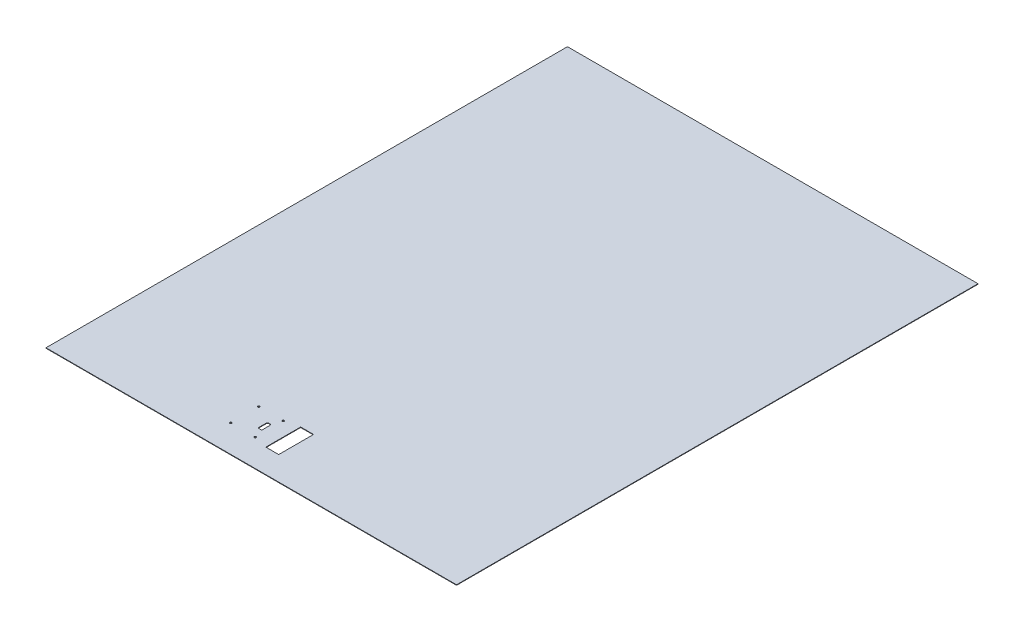
ISO-10303-21;
HEADER;
FILE_DESCRIPTION(('STEP AP214'),'2;1');
FILE_NAME('part.step','',(''),(''),'','','');
FILE_SCHEMA(('AUTOMOTIVE_DESIGN { 1 0 10303 214 1 1 1 1 }'));
ENDSEC;
DATA;
#1=APPLICATION_CONTEXT('core data for automotive mechanical design processes');
#2=APPLICATION_PROTOCOL_DEFINITION('international standard','automotive_design',2000,#1);
#3=PRODUCT_CONTEXT('',#1,'mechanical');
#4=PRODUCT('Part','Part','',(#3));
#5=PRODUCT_RELATED_PRODUCT_CATEGORY('part','',(#4));
#6=PRODUCT_DEFINITION_FORMATION('','',#4);
#7=PRODUCT_DEFINITION_CONTEXT('part definition',#1,'design');
#8=PRODUCT_DEFINITION('design','',#6,#7);
#9=PRODUCT_DEFINITION_SHAPE('','',#8);
#10=(LENGTH_UNIT() NAMED_UNIT(*) SI_UNIT(.MILLI.,.METRE.));
#11=(NAMED_UNIT(*) PLANE_ANGLE_UNIT() SI_UNIT($,.RADIAN.));
#12=(NAMED_UNIT(*) SI_UNIT($,.STERADIAN.) SOLID_ANGLE_UNIT());
#13=UNCERTAINTY_MEASURE_WITH_UNIT(LENGTH_MEASURE(1.E-05),#10,'distance_accuracy_value','');
#14=(GEOMETRIC_REPRESENTATION_CONTEXT(3) GLOBAL_UNCERTAINTY_ASSIGNED_CONTEXT((#13)) GLOBAL_UNIT_ASSIGNED_CONTEXT((#10,
#11,#12)) REPRESENTATION_CONTEXT('',''));
#15=CARTESIAN_POINT('',(0.,0.,0.));
#16=DIRECTION('',(0.,0.,1.));
#17=DIRECTION('',(1.,0.,0.));
#18=AXIS2_PLACEMENT_3D('',#15,#16,#17);
#19=CARTESIAN_POINT('',(612.606476286078,1.,310.950998870896));
#20=DIRECTION('',(-1.,0.,0.));
#21=DIRECTION('',(0.,0.,1.));
#22=AXIS2_PLACEMENT_3D('',#19,#20,#21);
#23=PLANE('',#22);
#24=DIRECTION('',(0.,0.,-1.));
#25=VECTOR('',#24,1.);
#26=CARTESIAN_POINT('',(612.606476286078,0.,310.950998870896));
#27=LINE('',#26,#25);
#28=CARTESIAN_POINT('',(612.606476286078,0.,310.950998870896));
#29=VERTEX_POINT('',#28);
#30=CARTESIAN_POINT('',(612.606476286078,0.,-782.049001129104));
#31=VERTEX_POINT('',#30);
#32=EDGE_CURVE('E191',#29,#31,#27,.T.);
#33=ORIENTED_EDGE('',*,*,#32,.T.);
#34=DIRECTION('',(0.,-1.,0.));
#35=VECTOR('',#34,1.);
#36=CARTESIAN_POINT('',(612.606476286078,1.,-782.049001129104));
#37=LINE('',#36,#35);
#38=CARTESIAN_POINT('',(612.606476286078,1.,-782.049001129104));
#39=VERTEX_POINT('',#38);
#40=EDGE_CURVE('E221',#39,#31,#37,.T.);
#41=ORIENTED_EDGE('',*,*,#40,.F.);
#42=DIRECTION('',(0.,0.,-1.));
#43=VECTOR('',#42,1.);
#44=CARTESIAN_POINT('',(612.606476286078,1.,310.950998870896));
#45=LINE('',#44,#43);
#46=CARTESIAN_POINT('',(612.606476286078,1.,310.950998870896));
#47=VERTEX_POINT('',#46);
#48=EDGE_CURVE('E195',#47,#39,#45,.T.);
#49=ORIENTED_EDGE('',*,*,#48,.F.);
#50=DIRECTION('',(0.,-1.,0.));
#51=VECTOR('',#50,1.);
#52=CARTESIAN_POINT('',(612.606476286078,1.,310.950998870896));
#53=LINE('',#52,#51);
#54=EDGE_CURVE('E205',#47,#29,#53,.T.);
#55=ORIENTED_EDGE('',*,*,#54,.T.);
#56=EDGE_LOOP('',(#33,#41,#49,#55));
#57=FACE_BOUND('',#56,.T.);
#58=ADVANCED_FACE('F33',(#57),#23,.F.);
#59=CARTESIAN_POINT('',(612.606476286078,1.,-782.049001129104));
#60=DIRECTION('',(0.,0.,1.));
#61=DIRECTION('',(1.,0.,0.));
#62=AXIS2_PLACEMENT_3D('',#59,#60,#61);
#63=PLANE('',#62);
#64=DIRECTION('',(-1.,0.,0.));
#65=VECTOR('',#64,1.);
#66=CARTESIAN_POINT('',(612.606476286078,0.,-782.049001129104));
#67=LINE('',#66,#65);
#68=CARTESIAN_POINT('',(-247.893523713922,0.,-782.049001129104));
#69=VERTEX_POINT('',#68);
#70=EDGE_CURVE('E208',#31,#69,#67,.T.);
#71=ORIENTED_EDGE('',*,*,#70,.T.);
#72=DIRECTION('',(0.,-1.,0.));
#73=VECTOR('',#72,1.);
#74=CARTESIAN_POINT('',(-247.893523713922,1.,-782.049001129104));
#75=LINE('',#74,#73);
#76=CARTESIAN_POINT('',(-247.893523713922,1.,-782.049001129104));
#77=VERTEX_POINT('',#76);
#78=EDGE_CURVE('E218',#77,#69,#75,.T.);
#79=ORIENTED_EDGE('',*,*,#78,.F.);
#80=DIRECTION('',(-1.,0.,0.));
#81=VECTOR('',#80,1.);
#82=CARTESIAN_POINT('',(612.606476286078,1.,-782.049001129104));
#83=LINE('',#82,#81);
#84=EDGE_CURVE('E198',#39,#77,#83,.T.);
#85=ORIENTED_EDGE('',*,*,#84,.F.);
#86=ORIENTED_EDGE('',*,*,#40,.T.);
#87=EDGE_LOOP('',(#71,#79,#85,#86));
#88=FACE_BOUND('',#87,.T.);
#89=ADVANCED_FACE('F330',(#88),#63,.F.);
#90=CARTESIAN_POINT('',(-247.893523713922,1.,310.950998870896));
#91=DIRECTION('',(1.,0.,0.));
#92=DIRECTION('',(0.,0.,-1.));
#93=AXIS2_PLACEMENT_3D('',#90,#91,#92);
#94=PLANE('',#93);
#95=DIRECTION('',(0.,0.,1.));
#96=VECTOR('',#95,1.);
#97=CARTESIAN_POINT('',(-247.893523713922,0.,310.950998870896));
#98=LINE('',#97,#96);
#99=CARTESIAN_POINT('',(-247.893523713922,0.,310.950998870896));
#100=VERTEX_POINT('',#99);
#101=EDGE_CURVE('E210',#69,#100,#98,.T.);
#102=ORIENTED_EDGE('',*,*,#101,.T.);
#103=DIRECTION('',(0.,-1.,0.));
#104=VECTOR('',#103,1.);
#105=CARTESIAN_POINT('',(-247.893523713922,1.,310.950998870896));
#106=LINE('',#105,#104);
#107=CARTESIAN_POINT('',(-247.893523713922,1.,310.950998870896));
#108=VERTEX_POINT('',#107);
#109=EDGE_CURVE('E215',#108,#100,#106,.T.);
#110=ORIENTED_EDGE('',*,*,#109,.F.);
#111=DIRECTION('',(0.,0.,1.));
#112=VECTOR('',#111,1.);
#113=CARTESIAN_POINT('',(-247.893523713922,1.,310.950998870896));
#114=LINE('',#113,#112);
#115=EDGE_CURVE('E201',#77,#108,#114,.T.);
#116=ORIENTED_EDGE('',*,*,#115,.F.);
#117=ORIENTED_EDGE('',*,*,#78,.T.);
#118=EDGE_LOOP('',(#102,#110,#116,#117));
#119=FACE_BOUND('',#118,.T.);
#120=ADVANCED_FACE('F335',(#119),#94,.F.);
#121=CARTESIAN_POINT('',(612.606476286078,1.,310.950998870896));
#122=DIRECTION('',(0.,0.,-1.));
#123=DIRECTION('',(-1.,0.,0.));
#124=AXIS2_PLACEMENT_3D('',#121,#122,#123);
#125=PLANE('',#124);
#126=DIRECTION('',(1.,0.,0.));
#127=VECTOR('',#126,1.);
#128=CARTESIAN_POINT('',(612.606476286078,0.,310.950998870896));
#129=LINE('',#128,#127);
#130=EDGE_CURVE('E199',#100,#29,#129,.T.);
#131=ORIENTED_EDGE('',*,*,#130,.T.);
#132=ORIENTED_EDGE('',*,*,#54,.F.);
#133=DIRECTION('',(1.,0.,0.));
#134=VECTOR('',#133,1.);
#135=CARTESIAN_POINT('',(612.606476286078,1.,310.950998870896));
#136=LINE('',#135,#134);
#137=EDGE_CURVE('E203',#108,#47,#136,.T.);
#138=ORIENTED_EDGE('',*,*,#137,.F.);
#139=ORIENTED_EDGE('',*,*,#109,.T.);
#140=EDGE_LOOP('',(#131,#132,#138,#139));
#141=FACE_BOUND('',#140,.T.);
#142=ADVANCED_FACE('F318',(#141),#125,.F.);
#143=CARTESIAN_POINT('',(0.,1.,0.));
#144=DIRECTION('',(0.,1.,0.));
#145=DIRECTION('',(0.,0.,1.));
#146=AXIS2_PLACEMENT_3D('',#143,#144,#145);
#147=PLANE('',#146);
#148=DIRECTION('',(0.,0.,-1.));
#149=VECTOR('',#148,1.);
#150=CARTESIAN_POINT('',(127.756476286078,1.,214.450998870896));
#151=LINE('',#150,#149);
#152=CARTESIAN_POINT('',(127.756476286078,1.,232.450998870896));
#153=VERTEX_POINT('',#152);
#154=CARTESIAN_POINT('',(127.756476286078,1.,216.450998870896));
#155=VERTEX_POINT('',#154);
#156=EDGE_CURVE('E258',#153,#155,#151,.T.);
#157=ORIENTED_EDGE('',*,*,#156,.F.);
#158=CARTESIAN_POINT('',(125.756476286078,1.,232.450998870896));
#159=DIRECTION('',(0.,1.,0.));
#160=DIRECTION('',(0.,0.,1.));
#161=AXIS2_PLACEMENT_3D('',#158,#159,#160);
#162=CIRCLE('',#161,2.);
#163=CARTESIAN_POINT('',(125.756476286078,1.,234.450998870896));
#164=VERTEX_POINT('',#163);
#165=EDGE_CURVE('E251',#153,#164,#162,.F.);
#166=ORIENTED_EDGE('',*,*,#165,.T.);
#167=DIRECTION('',(1.,0.,0.));
#168=VECTOR('',#167,1.);
#169=CARTESIAN_POINT('',(127.756476286078,1.,234.450998870896));
#170=LINE('',#169,#168);
#171=CARTESIAN_POINT('',(121.756476286078,1.,234.450998870896));
#172=VERTEX_POINT('',#171);
#173=EDGE_CURVE('E281',#172,#164,#170,.T.);
#174=ORIENTED_EDGE('',*,*,#173,.F.);
#175=CARTESIAN_POINT('',(121.756476286078,1.,232.450998870896));
#176=DIRECTION('',(0.,1.,0.));
#177=DIRECTION('',(0.,0.,1.));
#178=AXIS2_PLACEMENT_3D('',#175,#176,#177);
#179=CIRCLE('',#178,2.);
#180=CARTESIAN_POINT('',(119.756476286078,1.,232.450998870896));
#181=VERTEX_POINT('',#180);
#182=EDGE_CURVE('E247',#172,#181,#179,.F.);
#183=ORIENTED_EDGE('',*,*,#182,.T.);
#184=DIRECTION('',(0.,0.,1.));
#185=VECTOR('',#184,1.);
#186=CARTESIAN_POINT('',(119.756476286078,1.,214.450998870896));
#187=LINE('',#186,#185);
#188=CARTESIAN_POINT('',(119.756476286078,1.,216.450998870896));
#189=VERTEX_POINT('',#188);
#190=EDGE_CURVE('E287',#189,#181,#187,.T.);
#191=ORIENTED_EDGE('',*,*,#190,.F.);
#192=CARTESIAN_POINT('',(121.756476286078,1.,216.450998870896));
#193=DIRECTION('',(0.,1.,0.));
#194=DIRECTION('',(0.,0.,1.));
#195=AXIS2_PLACEMENT_3D('',#192,#193,#194);
#196=CIRCLE('',#195,2.);
#197=CARTESIAN_POINT('',(121.756476286078,1.,214.450998870896));
#198=VERTEX_POINT('',#197);
#199=EDGE_CURVE('E243',#189,#198,#196,.F.);
#200=ORIENTED_EDGE('',*,*,#199,.T.);
#201=DIRECTION('',(-1.,0.,0.));
#202=VECTOR('',#201,1.);
#203=CARTESIAN_POINT('',(127.756476286078,1.,214.450998870896));
#204=LINE('',#203,#202);
#205=CARTESIAN_POINT('',(125.756476286078,1.,214.450998870896));
#206=VERTEX_POINT('',#205);
#207=EDGE_CURVE('E260',#206,#198,#204,.T.);
#208=ORIENTED_EDGE('',*,*,#207,.F.);
#209=CARTESIAN_POINT('',(125.756476286078,1.,216.450998870896));
#210=DIRECTION('',(0.,1.,0.));
#211=DIRECTION('',(0.,0.,1.));
#212=AXIS2_PLACEMENT_3D('',#209,#210,#211);
#213=CIRCLE('',#212,2.);
#214=EDGE_CURVE('E41',#206,#155,#213,.F.);
#215=ORIENTED_EDGE('',*,*,#214,.T.);
#216=EDGE_LOOP('',(#157,#166,#174,#183,#191,#200,#208,#215));
#217=FACE_BOUND('',#216,.T.);
#218=CARTESIAN_POINT('',(133.656476286078,1.,253.950998870896));
#219=DIRECTION('',(0.,1.,0.));
#220=DIRECTION('',(0.,0.,1.));
#221=AXIS2_PLACEMENT_3D('',#218,#219,#220);
#222=CIRCLE('',#221,2.);
#223=CARTESIAN_POINT('',(133.656476286078,1.,255.950998870896));
#224=VERTEX_POINT('',#223);
#225=EDGE_CURVE('E295',#224,#224,#222,.T.);
#226=ORIENTED_EDGE('',*,*,#225,.F.);
#227=EDGE_LOOP('',(#226));
#228=FACE_BOUND('',#227,.T.);
#229=CARTESIAN_POINT('',(81.9764762860777,1.,194.950998870896));
#230=DIRECTION('',(0.,1.,0.));
#231=DIRECTION('',(0.,0.,1.));
#232=AXIS2_PLACEMENT_3D('',#229,#230,#231);
#233=CIRCLE('',#232,2.);
#234=CARTESIAN_POINT('',(81.9764762860777,1.,196.950998870896));
#235=VERTEX_POINT('',#234);
#236=EDGE_CURVE('E301',#235,#235,#233,.T.);
#237=ORIENTED_EDGE('',*,*,#236,.F.);
#238=EDGE_LOOP('',(#237));
#239=FACE_BOUND('',#238,.T.);
#240=CARTESIAN_POINT('',(81.9764762860777,1.,253.950998870896));
#241=DIRECTION('',(0.,1.,0.));
#242=DIRECTION('',(0.,0.,1.));
#243=AXIS2_PLACEMENT_3D('',#240,#241,#242);
#244=CIRCLE('',#243,2.);
#245=CARTESIAN_POINT('',(81.9764762860777,1.,255.950998870896));
#246=VERTEX_POINT('',#245);
#247=EDGE_CURVE('E284',#246,#246,#244,.T.);
#248=ORIENTED_EDGE('',*,*,#247,.F.);
#249=EDGE_LOOP('',(#248));
#250=FACE_BOUND('',#249,.T.);
#251=CARTESIAN_POINT('',(133.656476286078,1.,194.950998870896));
#252=DIRECTION('',(0.,1.,0.));
#253=DIRECTION('',(0.,0.,1.));
#254=AXIS2_PLACEMENT_3D('',#251,#252,#253);
#255=CIRCLE('',#254,2.);
#256=CARTESIAN_POINT('',(133.656476286078,1.,196.950998870896));
#257=VERTEX_POINT('',#256);
#258=EDGE_CURVE('E178',#257,#257,#255,.T.);
#259=ORIENTED_EDGE('',*,*,#258,.F.);
#260=EDGE_LOOP('',(#259));
#261=FACE_BOUND('',#260,.T.);
#262=DIRECTION('',(0.,0.,1.));
#263=VECTOR('',#262,1.);
#264=CARTESIAN_POINT('',(162.856476286078,1.,187.950998870896));
#265=LINE('',#264,#263);
#266=CARTESIAN_POINT('',(162.856476286078,1.,187.950998870896));
#267=VERTEX_POINT('',#266);
#268=CARTESIAN_POINT('',(162.856476286078,1.,260.950998870896));
#269=VERTEX_POINT('',#268);
#270=EDGE_CURVE('E154',#267,#269,#265,.T.);
#271=ORIENTED_EDGE('',*,*,#270,.F.);
#272=DIRECTION('',(-1.,0.,0.));
#273=VECTOR('',#272,1.);
#274=CARTESIAN_POINT('',(162.856476286078,1.,187.950998870896));
#275=LINE('',#274,#273);
#276=CARTESIAN_POINT('',(189.856476286078,1.,187.950998870896));
#277=VERTEX_POINT('',#276);
#278=EDGE_CURVE('E172',#277,#267,#275,.T.);
#279=ORIENTED_EDGE('',*,*,#278,.F.);
#280=DIRECTION('',(0.,0.,-1.));
#281=VECTOR('',#280,1.);
#282=CARTESIAN_POINT('',(189.856476286078,1.,187.950998870896));
#283=LINE('',#282,#281);
#284=CARTESIAN_POINT('',(189.856476286078,1.,260.950998870896));
#285=VERTEX_POINT('',#284);
#286=EDGE_CURVE('E175',#285,#277,#283,.T.);
#287=ORIENTED_EDGE('',*,*,#286,.F.);
#288=DIRECTION('',(1.,0.,0.));
#289=VECTOR('',#288,1.);
#290=CARTESIAN_POINT('',(162.856476286078,1.,260.950998870896));
#291=LINE('',#290,#289);
#292=EDGE_CURVE('E184',#269,#285,#291,.T.);
#293=ORIENTED_EDGE('',*,*,#292,.F.);
#294=EDGE_LOOP('',(#271,#279,#287,#293));
#295=FACE_BOUND('',#294,.T.);
#296=ORIENTED_EDGE('',*,*,#48,.T.);
#297=ORIENTED_EDGE('',*,*,#84,.T.);
#298=ORIENTED_EDGE('',*,*,#115,.T.);
#299=ORIENTED_EDGE('',*,*,#137,.T.);
#300=EDGE_LOOP('',(#296,#297,#298,#299));
#301=FACE_BOUND('',#300,.T.);
#302=ADVANCED_FACE('F256',(#217,#228,#239,#250,#261,#295,#301),#147,.T.);
#303=CARTESIAN_POINT('',(0.,0.,0.));
#304=DIRECTION('',(0.,1.,0.));
#305=DIRECTION('',(0.,0.,1.));
#306=AXIS2_PLACEMENT_3D('',#303,#304,#305);
#307=PLANE('',#306);
#308=DIRECTION('',(0.,0.,1.));
#309=VECTOR('',#308,1.);
#310=CARTESIAN_POINT('',(119.756476286078,0.,214.450998870896));
#311=LINE('',#310,#309);
#312=CARTESIAN_POINT('',(119.756476286078,0.,216.450998870896));
#313=VERTEX_POINT('',#312);
#314=CARTESIAN_POINT('',(119.756476286078,0.,232.450998870896));
#315=VERTEX_POINT('',#314);
#316=EDGE_CURVE('E277',#313,#315,#311,.T.);
#317=ORIENTED_EDGE('',*,*,#316,.T.);
#318=CARTESIAN_POINT('',(121.756476286078,0.,232.450998870896));
#319=DIRECTION('',(0.,1.,0.));
#320=DIRECTION('',(0.,0.,1.));
#321=AXIS2_PLACEMENT_3D('',#318,#319,#320);
#322=CIRCLE('',#321,2.);
#323=CARTESIAN_POINT('',(121.756476286078,0.,234.450998870896));
#324=VERTEX_POINT('',#323);
#325=EDGE_CURVE('E249',#315,#324,#322,.T.);
#326=ORIENTED_EDGE('',*,*,#325,.T.);
#327=DIRECTION('',(1.,0.,0.));
#328=VECTOR('',#327,1.);
#329=CARTESIAN_POINT('',(127.756476286078,0.,234.450998870896));
#330=LINE('',#329,#328);
#331=CARTESIAN_POINT('',(125.756476286078,0.,234.450998870896));
#332=VERTEX_POINT('',#331);
#333=EDGE_CURVE('E279',#324,#332,#330,.T.);
#334=ORIENTED_EDGE('',*,*,#333,.T.);
#335=CARTESIAN_POINT('',(125.756476286078,0.,232.450998870896));
#336=DIRECTION('',(0.,1.,0.));
#337=DIRECTION('',(0.,0.,1.));
#338=AXIS2_PLACEMENT_3D('',#335,#336,#337);
#339=CIRCLE('',#338,2.);
#340=CARTESIAN_POINT('',(127.756476286078,0.,232.450998870896));
#341=VERTEX_POINT('',#340);
#342=EDGE_CURVE('E55',#332,#341,#339,.T.);
#343=ORIENTED_EDGE('',*,*,#342,.T.);
#344=DIRECTION('',(0.,0.,-1.));
#345=VECTOR('',#344,1.);
#346=CARTESIAN_POINT('',(127.756476286078,0.,214.450998870896));
#347=LINE('',#346,#345);
#348=CARTESIAN_POINT('',(127.756476286078,0.,216.450998870896));
#349=VERTEX_POINT('',#348);
#350=EDGE_CURVE('E273',#341,#349,#347,.T.);
#351=ORIENTED_EDGE('',*,*,#350,.T.);
#352=CARTESIAN_POINT('',(125.756476286078,0.,216.450998870896));
#353=DIRECTION('',(0.,1.,0.));
#354=DIRECTION('',(0.,0.,1.));
#355=AXIS2_PLACEMENT_3D('',#352,#353,#354);
#356=CIRCLE('',#355,2.);
#357=CARTESIAN_POINT('',(125.756476286078,0.,214.450998870896));
#358=VERTEX_POINT('',#357);
#359=EDGE_CURVE('E11',#349,#358,#356,.T.);
#360=ORIENTED_EDGE('',*,*,#359,.T.);
#361=DIRECTION('',(-1.,0.,0.));
#362=VECTOR('',#361,1.);
#363=CARTESIAN_POINT('',(127.756476286078,0.,214.450998870896));
#364=LINE('',#363,#362);
#365=CARTESIAN_POINT('',(121.756476286078,0.,214.450998870896));
#366=VERTEX_POINT('',#365);
#367=EDGE_CURVE('E271',#358,#366,#364,.T.);
#368=ORIENTED_EDGE('',*,*,#367,.T.);
#369=CARTESIAN_POINT('',(121.756476286078,0.,216.450998870896));
#370=DIRECTION('',(0.,1.,0.));
#371=DIRECTION('',(0.,0.,1.));
#372=AXIS2_PLACEMENT_3D('',#369,#370,#371);
#373=CIRCLE('',#372,2.);
#374=EDGE_CURVE('E245',#366,#313,#373,.T.);
#375=ORIENTED_EDGE('',*,*,#374,.T.);
#376=EDGE_LOOP('',(#317,#326,#334,#343,#351,#360,#368,#375));
#377=FACE_BOUND('',#376,.T.);
#378=CARTESIAN_POINT('',(133.656476286078,0.,253.950998870896));
#379=DIRECTION('',(0.,1.,0.));
#380=DIRECTION('',(0.,0.,1.));
#381=AXIS2_PLACEMENT_3D('',#378,#379,#380);
#382=CIRCLE('',#381,2.);
#383=CARTESIAN_POINT('',(133.656476286078,0.,255.950998870896));
#384=VERTEX_POINT('',#383);
#385=EDGE_CURVE('E292',#384,#384,#382,.T.);
#386=ORIENTED_EDGE('',*,*,#385,.T.);
#387=EDGE_LOOP('',(#386));
#388=FACE_BOUND('',#387,.T.);
#389=CARTESIAN_POINT('',(81.9764762860777,0.,194.950998870896));
#390=DIRECTION('',(0.,1.,0.));
#391=DIRECTION('',(0.,0.,1.));
#392=AXIS2_PLACEMENT_3D('',#389,#390,#391);
#393=CIRCLE('',#392,2.);
#394=CARTESIAN_POINT('',(81.9764762860777,0.,196.950998870896));
#395=VERTEX_POINT('',#394);
#396=EDGE_CURVE('E298',#395,#395,#393,.T.);
#397=ORIENTED_EDGE('',*,*,#396,.T.);
#398=EDGE_LOOP('',(#397));
#399=FACE_BOUND('',#398,.T.);
#400=CARTESIAN_POINT('',(81.9764762860777,0.,253.950998870896));
#401=DIRECTION('',(0.,1.,0.));
#402=DIRECTION('',(0.,0.,1.));
#403=AXIS2_PLACEMENT_3D('',#400,#401,#402);
#404=CIRCLE('',#403,2.);
#405=CARTESIAN_POINT('',(81.9764762860777,0.,255.950998870896));
#406=VERTEX_POINT('',#405);
#407=EDGE_CURVE('E304',#406,#406,#404,.T.);
#408=ORIENTED_EDGE('',*,*,#407,.T.);
#409=EDGE_LOOP('',(#408));
#410=FACE_BOUND('',#409,.T.);
#411=CARTESIAN_POINT('',(133.656476286078,0.,194.950998870896));
#412=DIRECTION('',(0.,1.,0.));
#413=DIRECTION('',(0.,0.,1.));
#414=AXIS2_PLACEMENT_3D('',#411,#412,#413);
#415=CIRCLE('',#414,2.);
#416=CARTESIAN_POINT('',(133.656476286078,0.,196.950998870896));
#417=VERTEX_POINT('',#416);
#418=EDGE_CURVE('E185',#417,#417,#415,.T.);
#419=ORIENTED_EDGE('',*,*,#418,.T.);
#420=EDGE_LOOP('',(#419));
#421=FACE_BOUND('',#420,.T.);
#422=DIRECTION('',(-1.,0.,0.));
#423=VECTOR('',#422,1.);
#424=CARTESIAN_POINT('',(162.856476286078,0.,187.950998870896));
#425=LINE('',#424,#423);
#426=CARTESIAN_POINT('',(189.856476286078,0.,187.950998870896));
#427=VERTEX_POINT('',#426);
#428=CARTESIAN_POINT('',(162.856476286078,0.,187.950998870896));
#429=VERTEX_POINT('',#428);
#430=EDGE_CURVE('E159',#427,#429,#425,.T.);
#431=ORIENTED_EDGE('',*,*,#430,.T.);
#432=DIRECTION('',(0.,0.,1.));
#433=VECTOR('',#432,1.);
#434=CARTESIAN_POINT('',(162.856476286078,0.,187.950998870896));
#435=LINE('',#434,#433);
#436=CARTESIAN_POINT('',(162.856476286078,0.,260.950998870896));
#437=VERTEX_POINT('',#436);
#438=EDGE_CURVE('E151',#429,#437,#435,.T.);
#439=ORIENTED_EDGE('',*,*,#438,.T.);
#440=DIRECTION('',(1.,0.,0.));
#441=VECTOR('',#440,1.);
#442=CARTESIAN_POINT('',(162.856476286078,0.,260.950998870896));
#443=LINE('',#442,#441);
#444=CARTESIAN_POINT('',(189.856476286078,0.,260.950998870896));
#445=VERTEX_POINT('',#444);
#446=EDGE_CURVE('E163',#437,#445,#443,.T.);
#447=ORIENTED_EDGE('',*,*,#446,.T.);
#448=DIRECTION('',(0.,0.,-1.));
#449=VECTOR('',#448,1.);
#450=CARTESIAN_POINT('',(189.856476286078,0.,187.950998870896));
#451=LINE('',#450,#449);
#452=EDGE_CURVE('E167',#445,#427,#451,.T.);
#453=ORIENTED_EDGE('',*,*,#452,.T.);
#454=EDGE_LOOP('',(#431,#439,#447,#453));
#455=FACE_BOUND('',#454,.T.);
#456=ORIENTED_EDGE('',*,*,#32,.F.);
#457=ORIENTED_EDGE('',*,*,#130,.F.);
#458=ORIENTED_EDGE('',*,*,#101,.F.);
#459=ORIENTED_EDGE('',*,*,#70,.F.);
#460=EDGE_LOOP('',(#456,#457,#458,#459));
#461=FACE_BOUND('',#460,.T.);
#462=ADVANCED_FACE('F169',(#377,#388,#399,#410,#421,#455,#461),#307,.F.);
#463=CARTESIAN_POINT('',(162.856476286078,0.,187.950998870896));
#464=DIRECTION('',(-1.,0.,0.));
#465=DIRECTION('',(0.,0.,1.));
#466=AXIS2_PLACEMENT_3D('',#463,#464,#465);
#467=PLANE('',#466);
#468=ORIENTED_EDGE('',*,*,#270,.T.);
#469=DIRECTION('',(0.,1.,0.));
#470=VECTOR('',#469,1.);
#471=CARTESIAN_POINT('',(162.856476286078,0.,260.950998870896));
#472=LINE('',#471,#470);
#473=EDGE_CURVE('E147',#437,#269,#472,.T.);
#474=ORIENTED_EDGE('',*,*,#473,.F.);
#475=ORIENTED_EDGE('',*,*,#438,.F.);
#476=DIRECTION('',(0.,1.,0.));
#477=VECTOR('',#476,1.);
#478=CARTESIAN_POINT('',(162.856476286078,0.,187.950998870896));
#479=LINE('',#478,#477);
#480=EDGE_CURVE('E189',#429,#267,#479,.T.);
#481=ORIENTED_EDGE('',*,*,#480,.T.);
#482=EDGE_LOOP('',(#468,#474,#475,#481));
#483=FACE_BOUND('',#482,.T.);
#484=ADVANCED_FACE('F149',(#483),#467,.F.);
#485=CARTESIAN_POINT('',(162.856476286078,0.,187.950998870896));
#486=DIRECTION('',(0.,0.,-1.));
#487=DIRECTION('',(-1.,0.,0.));
#488=AXIS2_PLACEMENT_3D('',#485,#486,#487);
#489=PLANE('',#488);
#490=ORIENTED_EDGE('',*,*,#278,.T.);
#491=ORIENTED_EDGE('',*,*,#480,.F.);
#492=ORIENTED_EDGE('',*,*,#430,.F.);
#493=DIRECTION('',(0.,1.,0.));
#494=VECTOR('',#493,1.);
#495=CARTESIAN_POINT('',(189.856476286078,0.,187.950998870896));
#496=LINE('',#495,#494);
#497=EDGE_CURVE('E192',#427,#277,#496,.T.);
#498=ORIENTED_EDGE('',*,*,#497,.T.);
#499=EDGE_LOOP('',(#490,#491,#492,#498));
#500=FACE_BOUND('',#499,.T.);
#501=ADVANCED_FACE('F343',(#500),#489,.F.);
#502=CARTESIAN_POINT('',(189.856476286078,0.,187.950998870896));
#503=DIRECTION('',(1.,0.,0.));
#504=DIRECTION('',(0.,0.,-1.));
#505=AXIS2_PLACEMENT_3D('',#502,#503,#504);
#506=PLANE('',#505);
#507=ORIENTED_EDGE('',*,*,#286,.T.);
#508=ORIENTED_EDGE('',*,*,#497,.F.);
#509=ORIENTED_EDGE('',*,*,#452,.F.);
#510=DIRECTION('',(0.,1.,0.));
#511=VECTOR('',#510,1.);
#512=CARTESIAN_POINT('',(189.856476286078,0.,260.950998870896));
#513=LINE('',#512,#511);
#514=EDGE_CURVE('E158',#445,#285,#513,.T.);
#515=ORIENTED_EDGE('',*,*,#514,.T.);
#516=EDGE_LOOP('',(#507,#508,#509,#515));
#517=FACE_BOUND('',#516,.T.);
#518=ADVANCED_FACE('F408',(#517),#506,.F.);
#519=CARTESIAN_POINT('',(162.856476286078,0.,260.950998870896));
#520=DIRECTION('',(0.,0.,1.));
#521=DIRECTION('',(1.,0.,0.));
#522=AXIS2_PLACEMENT_3D('',#519,#520,#521);
#523=PLANE('',#522);
#524=ORIENTED_EDGE('',*,*,#292,.T.);
#525=ORIENTED_EDGE('',*,*,#514,.F.);
#526=ORIENTED_EDGE('',*,*,#446,.F.);
#527=ORIENTED_EDGE('',*,*,#473,.T.);
#528=EDGE_LOOP('',(#524,#525,#526,#527));
#529=FACE_BOUND('',#528,.T.);
#530=ADVANCED_FACE('F164',(#529),#523,.F.);
#531=CARTESIAN_POINT('',(133.656476286078,0.,194.950998870896));
#532=DIRECTION('',(0.,1.,0.));
#533=DIRECTION('',(0.,0.,1.));
#534=AXIS2_PLACEMENT_3D('',#531,#532,#533);
#535=CYLINDRICAL_SURFACE('',#534,2.);
#536=ORIENTED_EDGE('',*,*,#418,.F.);
#537=EDGE_LOOP('',(#536));
#538=FACE_BOUND('',#537,.T.);
#539=ORIENTED_EDGE('',*,*,#258,.T.);
#540=EDGE_LOOP('',(#539));
#541=FACE_BOUND('',#540,.T.);
#542=ADVANCED_FACE('F314',(#538,#541),#535,.F.);
#543=CARTESIAN_POINT('',(81.9764762860777,0.,253.950998870896));
#544=DIRECTION('',(0.,1.,0.));
#545=DIRECTION('',(0.,0.,1.));
#546=AXIS2_PLACEMENT_3D('',#543,#544,#545);
#547=CYLINDRICAL_SURFACE('',#546,2.);
#548=ORIENTED_EDGE('',*,*,#407,.F.);
#549=EDGE_LOOP('',(#548));
#550=FACE_BOUND('',#549,.T.);
#551=ORIENTED_EDGE('',*,*,#247,.T.);
#552=EDGE_LOOP('',(#551));
#553=FACE_BOUND('',#552,.T.);
#554=ADVANCED_FACE('F398',(#550,#553),#547,.F.);
#555=CARTESIAN_POINT('',(81.9764762860777,0.,194.950998870896));
#556=DIRECTION('',(0.,1.,0.));
#557=DIRECTION('',(0.,0.,1.));
#558=AXIS2_PLACEMENT_3D('',#555,#556,#557);
#559=CYLINDRICAL_SURFACE('',#558,2.);
#560=ORIENTED_EDGE('',*,*,#396,.F.);
#561=EDGE_LOOP('',(#560));
#562=FACE_BOUND('',#561,.T.);
#563=ORIENTED_EDGE('',*,*,#236,.T.);
#564=EDGE_LOOP('',(#563));
#565=FACE_BOUND('',#564,.T.);
#566=ADVANCED_FACE('F394',(#562,#565),#559,.F.);
#567=CARTESIAN_POINT('',(133.656476286078,0.,253.950998870896));
#568=DIRECTION('',(0.,1.,0.));
#569=DIRECTION('',(0.,0.,1.));
#570=AXIS2_PLACEMENT_3D('',#567,#568,#569);
#571=CYLINDRICAL_SURFACE('',#570,2.);
#572=ORIENTED_EDGE('',*,*,#385,.F.);
#573=EDGE_LOOP('',(#572));
#574=FACE_BOUND('',#573,.T.);
#575=ORIENTED_EDGE('',*,*,#225,.T.);
#576=EDGE_LOOP('',(#575));
#577=FACE_BOUND('',#576,.T.);
#578=ADVANCED_FACE('F391',(#574,#577),#571,.F.);
#579=CARTESIAN_POINT('',(127.756476286078,0.,214.450998870896));
#580=DIRECTION('',(1.,0.,0.));
#581=DIRECTION('',(0.,0.,-1.));
#582=AXIS2_PLACEMENT_3D('',#579,#580,#581);
#583=PLANE('',#582);
#584=ORIENTED_EDGE('',*,*,#350,.F.);
#585=DIRECTION('',(0.,1.,0.));
#586=VECTOR('',#585,1.);
#587=CARTESIAN_POINT('',(127.756476286078,1.,232.450998870896));
#588=LINE('',#587,#586);
#589=EDGE_CURVE('E240',#341,#153,#588,.T.);
#590=ORIENTED_EDGE('',*,*,#589,.T.);
#591=ORIENTED_EDGE('',*,*,#156,.T.);
#592=DIRECTION('',(0.,1.,0.));
#593=VECTOR('',#592,1.);
#594=CARTESIAN_POINT('',(127.756476286078,0.,216.450998870896));
#595=LINE('',#594,#593);
#596=EDGE_CURVE('E48',#155,#349,#595,.F.);
#597=ORIENTED_EDGE('',*,*,#596,.T.);
#598=EDGE_LOOP('',(#584,#590,#591,#597));
#599=FACE_BOUND('',#598,.T.);
#600=ADVANCED_FACE('F263',(#599),#583,.F.);
#601=CARTESIAN_POINT('',(127.756476286078,0.,234.450998870896));
#602=DIRECTION('',(0.,0.,1.));
#603=DIRECTION('',(1.,0.,0.));
#604=AXIS2_PLACEMENT_3D('',#601,#602,#603);
#605=PLANE('',#604);
#606=ORIENTED_EDGE('',*,*,#333,.F.);
#607=DIRECTION('',(0.,1.,0.));
#608=VECTOR('',#607,1.);
#609=CARTESIAN_POINT('',(121.756476286078,1.,234.450998870896));
#610=LINE('',#609,#608);
#611=EDGE_CURVE('E236',#324,#172,#610,.T.);
#612=ORIENTED_EDGE('',*,*,#611,.T.);
#613=ORIENTED_EDGE('',*,*,#173,.T.);
#614=DIRECTION('',(0.,1.,0.));
#615=VECTOR('',#614,1.);
#616=CARTESIAN_POINT('',(125.756476286078,0.,234.450998870896));
#617=LINE('',#616,#615);
#618=EDGE_CURVE('E234',#164,#332,#617,.F.);
#619=ORIENTED_EDGE('',*,*,#618,.T.);
#620=EDGE_LOOP('',(#606,#612,#613,#619));
#621=FACE_BOUND('',#620,.T.);
#622=ADVANCED_FACE('F371',(#621),#605,.F.);
#623=CARTESIAN_POINT('',(119.756476286078,0.,214.450998870896));
#624=DIRECTION('',(-1.,0.,0.));
#625=DIRECTION('',(0.,0.,1.));
#626=AXIS2_PLACEMENT_3D('',#623,#624,#625);
#627=PLANE('',#626);
#628=ORIENTED_EDGE('',*,*,#316,.F.);
#629=DIRECTION('',(0.,1.,0.));
#630=VECTOR('',#629,1.);
#631=CARTESIAN_POINT('',(119.756476286078,1.,216.450998870896));
#632=LINE('',#631,#630);
#633=EDGE_CURVE('E226',#313,#189,#632,.T.);
#634=ORIENTED_EDGE('',*,*,#633,.T.);
#635=ORIENTED_EDGE('',*,*,#190,.T.);
#636=DIRECTION('',(0.,1.,0.));
#637=VECTOR('',#636,1.);
#638=CARTESIAN_POINT('',(119.756476286078,0.,232.450998870896));
#639=LINE('',#638,#637);
#640=EDGE_CURVE('E224',#181,#315,#639,.F.);
#641=ORIENTED_EDGE('',*,*,#640,.T.);
#642=EDGE_LOOP('',(#628,#634,#635,#641));
#643=FACE_BOUND('',#642,.T.);
#644=ADVANCED_FACE('F378',(#643),#627,.F.);
#645=CARTESIAN_POINT('',(127.756476286078,0.,214.450998870896));
#646=DIRECTION('',(0.,0.,-1.));
#647=DIRECTION('',(-1.,0.,0.));
#648=AXIS2_PLACEMENT_3D('',#645,#646,#647);
#649=PLANE('',#648);
#650=ORIENTED_EDGE('',*,*,#207,.T.);
#651=DIRECTION('',(0.,1.,0.));
#652=VECTOR('',#651,1.);
#653=CARTESIAN_POINT('',(121.756476286078,0.,214.450998870896));
#654=LINE('',#653,#652);
#655=EDGE_CURVE('E232',#198,#366,#654,.F.);
#656=ORIENTED_EDGE('',*,*,#655,.T.);
#657=ORIENTED_EDGE('',*,*,#367,.F.);
#658=DIRECTION('',(0.,1.,0.));
#659=VECTOR('',#658,1.);
#660=CARTESIAN_POINT('',(125.756476286078,1.,214.450998870896));
#661=LINE('',#660,#659);
#662=EDGE_CURVE('E229',#358,#206,#661,.T.);
#663=ORIENTED_EDGE('',*,*,#662,.T.);
#664=EDGE_LOOP('',(#650,#656,#657,#663));
#665=FACE_BOUND('',#664,.T.);
#666=ADVANCED_FACE('F275',(#665),#649,.F.);
#667=CARTESIAN_POINT('',(121.756476286078,0.,216.450998870896));
#668=DIRECTION('',(0.,-1.,0.));
#669=DIRECTION('',(0.,0.,-1.));
#670=AXIS2_PLACEMENT_3D('',#667,#668,#669);
#671=CYLINDRICAL_SURFACE('',#670,2.);
#672=ORIENTED_EDGE('',*,*,#374,.F.);
#673=ORIENTED_EDGE('',*,*,#655,.F.);
#674=ORIENTED_EDGE('',*,*,#199,.F.);
#675=ORIENTED_EDGE('',*,*,#633,.F.);
#676=EDGE_LOOP('',(#672,#673,#674,#675));
#677=FACE_BOUND('',#676,.T.);
#678=ADVANCED_FACE('F354',(#677),#671,.F.);
#679=CARTESIAN_POINT('',(121.756476286078,0.,232.450998870896));
#680=DIRECTION('',(0.,-1.,0.));
#681=DIRECTION('',(0.,0.,-1.));
#682=AXIS2_PLACEMENT_3D('',#679,#680,#681);
#683=CYLINDRICAL_SURFACE('',#682,2.);
#684=ORIENTED_EDGE('',*,*,#325,.F.);
#685=ORIENTED_EDGE('',*,*,#640,.F.);
#686=ORIENTED_EDGE('',*,*,#182,.F.);
#687=ORIENTED_EDGE('',*,*,#611,.F.);
#688=EDGE_LOOP('',(#684,#685,#686,#687));
#689=FACE_BOUND('',#688,.T.);
#690=ADVANCED_FACE('F357',(#689),#683,.F.);
#691=CARTESIAN_POINT('',(125.756476286078,0.,232.450998870896));
#692=DIRECTION('',(0.,-1.,0.));
#693=DIRECTION('',(0.,0.,-1.));
#694=AXIS2_PLACEMENT_3D('',#691,#692,#693);
#695=CYLINDRICAL_SURFACE('',#694,2.);
#696=ORIENTED_EDGE('',*,*,#342,.F.);
#697=ORIENTED_EDGE('',*,*,#618,.F.);
#698=ORIENTED_EDGE('',*,*,#165,.F.);
#699=ORIENTED_EDGE('',*,*,#589,.F.);
#700=EDGE_LOOP('',(#696,#697,#698,#699));
#701=FACE_BOUND('',#700,.T.);
#702=ADVANCED_FACE('F360',(#701),#695,.F.);
#703=CARTESIAN_POINT('',(125.756476286078,0.,216.450998870896));
#704=DIRECTION('',(0.,-1.,0.));
#705=DIRECTION('',(0.,0.,-1.));
#706=AXIS2_PLACEMENT_3D('',#703,#704,#705);
#707=CYLINDRICAL_SURFACE('',#706,2.);
#708=ORIENTED_EDGE('',*,*,#359,.F.);
#709=ORIENTED_EDGE('',*,*,#596,.F.);
#710=ORIENTED_EDGE('',*,*,#214,.F.);
#711=ORIENTED_EDGE('',*,*,#662,.F.);
#712=EDGE_LOOP('',(#708,#709,#710,#711));
#713=FACE_BOUND('',#712,.T.);
#714=ADVANCED_FACE('F35',(#713),#707,.F.);
#715=CLOSED_SHELL('',(#58,#89,#120,#142,#302,#462,#484,#501,#518,#530,#542,#554,#566,#578,#600,
#622,#644,#666,#678,#690,#702,#714));
#716=MANIFOLD_SOLID_BREP('B2',#715);
#717=ADVANCED_BREP_SHAPE_REPRESENTATION('',(#18,#716),#14);
#718=SHAPE_DEFINITION_REPRESENTATION(#9,#717);
ENDSEC;
END-ISO-10303-21;
